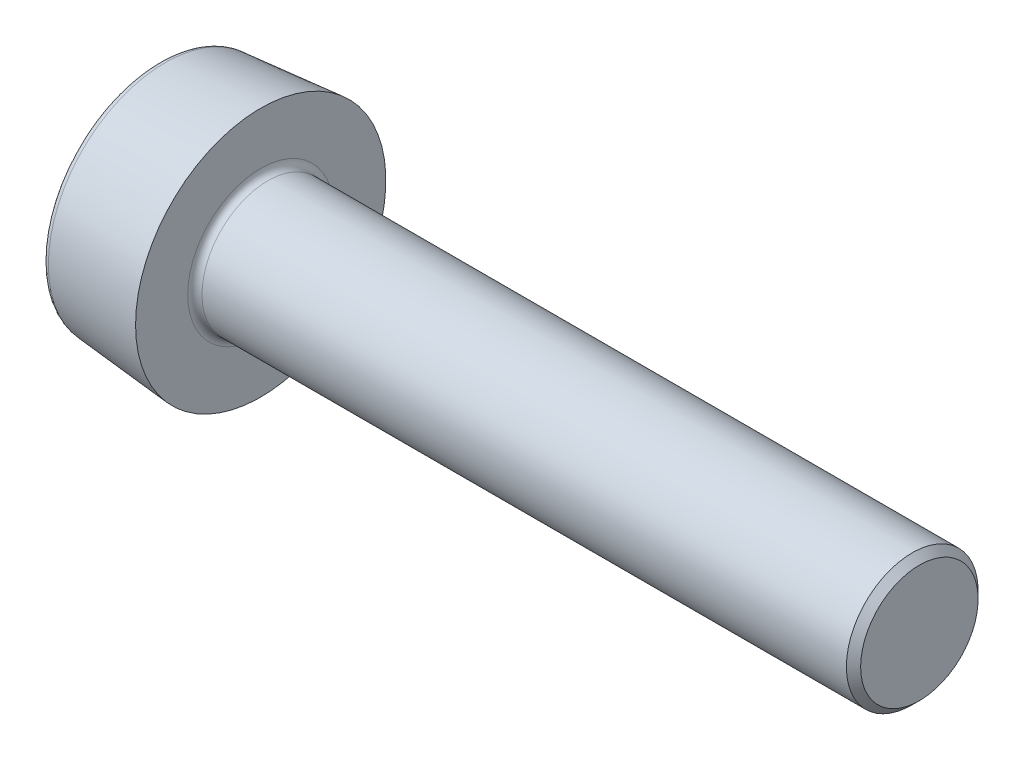
ISO-10303-21;
HEADER;
FILE_DESCRIPTION(('STEP AP214'),'2;1');
FILE_NAME('part.step','',(''),(''),'','','');
FILE_SCHEMA(('AUTOMOTIVE_DESIGN { 1 0 10303 214 1 1 1 1 }'));
ENDSEC;
DATA;
#1=APPLICATION_CONTEXT('core data for automotive mechanical design processes');
#2=APPLICATION_PROTOCOL_DEFINITION('international standard','automotive_design',2000,#1);
#3=PRODUCT_CONTEXT('',#1,'mechanical');
#4=PRODUCT('Part','Part','',(#3));
#5=PRODUCT_RELATED_PRODUCT_CATEGORY('part','',(#4));
#6=PRODUCT_DEFINITION_FORMATION('','',#4);
#7=PRODUCT_DEFINITION_CONTEXT('part definition',#1,'design');
#8=PRODUCT_DEFINITION('design','',#6,#7);
#9=PRODUCT_DEFINITION_SHAPE('','',#8);
#10=(LENGTH_UNIT() NAMED_UNIT(*) SI_UNIT(.MILLI.,.METRE.));
#11=(NAMED_UNIT(*) PLANE_ANGLE_UNIT() SI_UNIT($,.RADIAN.));
#12=(NAMED_UNIT(*) SI_UNIT($,.STERADIAN.) SOLID_ANGLE_UNIT());
#13=UNCERTAINTY_MEASURE_WITH_UNIT(LENGTH_MEASURE(1.E-05),#10,'distance_accuracy_value','');
#14=(GEOMETRIC_REPRESENTATION_CONTEXT(3) GLOBAL_UNCERTAINTY_ASSIGNED_CONTEXT((#13)) GLOBAL_UNIT_ASSIGNED_CONTEXT((#10,
#11,#12)) REPRESENTATION_CONTEXT('',''));
#15=CARTESIAN_POINT('',(0.,0.,0.));
#16=DIRECTION('',(0.,0.,1.));
#17=DIRECTION('',(1.,0.,0.));
#18=AXIS2_PLACEMENT_3D('',#15,#16,#17);
#19=CARTESIAN_POINT('',(0.,0.,0.));
#20=DIRECTION('',(-1.,0.,0.));
#21=DIRECTION('',(0.,0.,1.));
#22=AXIS2_PLACEMENT_3D('',#19,#20,#21);
#23=CYLINDRICAL_SURFACE('',#22,1.);
#24=CARTESIAN_POINT('',(9.89175,0.,0.));
#25=DIRECTION('',(-1.,0.,0.));
#26=DIRECTION('',(0.,0.,1.));
#27=AXIS2_PLACEMENT_3D('',#24,#25,#26);
#28=CIRCLE('',#27,1.);
#29=CARTESIAN_POINT('',(9.89175,0.,1.));
#30=VERTEX_POINT('',#29);
#31=EDGE_CURVE('E322',#30,#30,#28,.T.);
#32=ORIENTED_EDGE('',*,*,#31,.T.);
#33=EDGE_LOOP('',(#32));
#34=FACE_BOUND('',#33,.T.);
#35=CARTESIAN_POINT('',(0.10825,0.,0.));
#36=DIRECTION('',(-1.,0.,0.));
#37=DIRECTION('',(0.,0.,1.));
#38=AXIS2_PLACEMENT_3D('',#35,#36,#37);
#39=CIRCLE('',#38,1.);
#40=CARTESIAN_POINT('',(0.10825,0.,1.));
#41=VERTEX_POINT('',#40);
#42=EDGE_CURVE('E11',#41,#41,#39,.T.);
#43=ORIENTED_EDGE('',*,*,#42,.F.);
#44=EDGE_LOOP('',(#43));
#45=FACE_BOUND('',#44,.T.);
#46=ADVANCED_FACE('F17',(#34,#45),#23,.T.);
#47=CARTESIAN_POINT('',(0.10825,0.,0.));
#48=DIRECTION('',(-1.,0.,0.));
#49=DIRECTION('',(0.,0.,1.));
#50=AXIS2_PLACEMENT_3D('',#47,#48,#49);
#51=TOROIDAL_SURFACE('',#50,1.10825,0.10825);
#52=ORIENTED_EDGE('',*,*,#42,.T.);
#53=EDGE_LOOP('',(#52));
#54=FACE_BOUND('',#53,.T.);
#55=CARTESIAN_POINT('',(0.,0.,0.));
#56=DIRECTION('',(-1.,0.,0.));
#57=DIRECTION('',(0.,0.,1.));
#58=AXIS2_PLACEMENT_3D('',#55,#56,#57);
#59=CIRCLE('',#58,1.10825);
#60=CARTESIAN_POINT('',(0.,0.,1.10825));
#61=VERTEX_POINT('',#60);
#62=EDGE_CURVE('E25',#61,#61,#59,.T.);
#63=ORIENTED_EDGE('',*,*,#62,.F.);
#64=EDGE_LOOP('',(#63));
#65=FACE_BOUND('',#64,.T.);
#66=ADVANCED_FACE('F354',(#54,#65),#51,.F.);
#67=CARTESIAN_POINT('',(0.,1.10825,0.));
#68=DIRECTION('',(-1.,0.,0.));
#69=DIRECTION('',(0.,0.,1.));
#70=AXIS2_PLACEMENT_3D('',#67,#68,#69);
#71=PLANE('',#70);
#72=CARTESIAN_POINT('',(0.,0.,0.));
#73=DIRECTION('',(-1.,0.,0.));
#74=DIRECTION('',(0.,0.,1.));
#75=AXIS2_PLACEMENT_3D('',#72,#73,#74);
#76=CIRCLE('',#75,1.9);
#77=CARTESIAN_POINT('',(0.,0.,1.9));
#78=VERTEX_POINT('',#77);
#79=EDGE_CURVE('E342',#78,#78,#76,.T.);
#80=ORIENTED_EDGE('',*,*,#79,.F.);
#81=EDGE_LOOP('',(#80));
#82=FACE_BOUND('',#81,.T.);
#83=ORIENTED_EDGE('',*,*,#62,.T.);
#84=EDGE_LOOP('',(#83));
#85=FACE_BOUND('',#84,.T.);
#86=ADVANCED_FACE('F352',(#82,#85),#71,.F.);
#87=CARTESIAN_POINT('',(-1.45118460915243,0.,0.));
#88=DIRECTION('',(1.,0.,0.));
#89=DIRECTION('',(0.,0.,-1.));
#90=AXIS2_PLACEMENT_3D('',#87,#88,#89);
#91=CONICAL_SURFACE('',#90,1.77303779801586,0.0872664625997164);
#92=ORIENTED_EDGE('',*,*,#79,.T.);
#93=EDGE_LOOP('',(#92));
#94=FACE_BOUND('',#93,.T.);
#95=CARTESIAN_POINT('',(-1.45118460915243,0.,0.));
#96=DIRECTION('',(-1.,0.,0.));
#97=DIRECTION('',(0.,0.,1.));
#98=AXIS2_PLACEMENT_3D('',#95,#96,#97);
#99=CIRCLE('',#98,1.77303779801586);
#100=CARTESIAN_POINT('',(-1.45118460915243,0.,1.77303779801586));
#101=VERTEX_POINT('',#100);
#102=EDGE_CURVE('E338',#101,#101,#99,.T.);
#103=ORIENTED_EDGE('',*,*,#102,.F.);
#104=EDGE_LOOP('',(#103));
#105=FACE_BOUND('',#104,.T.);
#106=ADVANCED_FACE('F362',(#94,#105),#91,.T.);
#107=CARTESIAN_POINT('',(-1.44175,0.,0.));
#108=DIRECTION('',(-1.,0.,0.));
#109=DIRECTION('',(0.,0.,1.));
#110=AXIS2_PLACEMENT_3D('',#107,#108,#109);
#111=TOROIDAL_SURFACE('',#110,1.66519972194743,0.10825);
#112=CARTESIAN_POINT('',(-1.55,0.,0.));
#113=DIRECTION('',(-1.,0.,0.));
#114=DIRECTION('',(0.,0.,1.));
#115=AXIS2_PLACEMENT_3D('',#112,#113,#114);
#116=CIRCLE('',#115,1.66519972194743);
#117=CARTESIAN_POINT('',(-1.55,0.,1.66519972194743));
#118=VERTEX_POINT('',#117);
#119=EDGE_CURVE('E334',#118,#118,#116,.T.);
#120=ORIENTED_EDGE('',*,*,#119,.F.);
#121=EDGE_LOOP('',(#120));
#122=FACE_BOUND('',#121,.T.);
#123=ORIENTED_EDGE('',*,*,#102,.T.);
#124=EDGE_LOOP('',(#123));
#125=FACE_BOUND('',#124,.T.);
#126=ADVANCED_FACE('F369',(#122,#125),#111,.T.);
#127=CARTESIAN_POINT('',(-1.55,0.,0.));
#128=DIRECTION('',(-1.,0.,0.));
#129=DIRECTION('',(0.,0.,1.));
#130=AXIS2_PLACEMENT_3D('',#127,#128,#129);
#131=PLANE('',#130);
#132=CARTESIAN_POINT('',(-1.55,-1.06088111963594,-0.6125));
#133=DIRECTION('',(1.,0.,0.));
#134=DIRECTION('',(0.,0.,-1.));
#135=AXIS2_PLACEMENT_3D('',#132,#133,#134);
#136=CIRCLE('',#135,0.554830537352329);
#137=CARTESIAN_POINT('',(-1.55,-0.514312095755914,-0.707889870078079));
#138=VERTEX_POINT('',#137);
#139=CARTESIAN_POINT('',(-1.55,-0.870206658447239,-0.0914624053591971));
#140=VERTEX_POINT('',#139);
#141=EDGE_CURVE('E217',#138,#140,#136,.T.);
#142=ORIENTED_EDGE('',*,*,#141,.F.);
#143=CARTESIAN_POINT('',(-1.55,0.,0.));
#144=DIRECTION('',(-1.,0.,0.));
#145=DIRECTION('',(0.,0.,1.));
#146=AXIS2_PLACEMENT_3D('',#143,#144,#145);
#147=CIRCLE('',#146,0.875);
#148=CARTESIAN_POINT('',(-1.55,-0.355894562691325,-0.799352275437276));
#149=VERTEX_POINT('',#148);
#150=EDGE_CURVE('E156',#149,#138,#147,.T.);
#151=ORIENTED_EDGE('',*,*,#150,.F.);
#152=CARTESIAN_POINT('',(-1.55,0.,-1.225));
#153=DIRECTION('',(1.,0.,0.));
#154=DIRECTION('',(0.,0.,-1.));
#155=AXIS2_PLACEMENT_3D('',#152,#153,#154);
#156=CIRCLE('',#155,0.554830537352329);
#157=CARTESIAN_POINT('',(-1.55,0.355894562691326,-0.799352275437276));
#158=VERTEX_POINT('',#157);
#159=EDGE_CURVE('E213',#158,#149,#156,.T.);
#160=ORIENTED_EDGE('',*,*,#159,.F.);
#161=CARTESIAN_POINT('',(-1.55,0.514312095755914,-0.707889870078079));
#162=VERTEX_POINT('',#161);
#163=EDGE_CURVE('E148',#162,#158,#147,.T.);
#164=ORIENTED_EDGE('',*,*,#163,.F.);
#165=CARTESIAN_POINT('',(-1.55,1.06088111963594,-0.6125));
#166=DIRECTION('',(1.,0.,0.));
#167=DIRECTION('',(0.,0.,-1.));
#168=AXIS2_PLACEMENT_3D('',#165,#166,#167);
#169=CIRCLE('',#168,0.554830537352329);
#170=CARTESIAN_POINT('',(-1.55,0.87020665844724,-0.0914624053591967));
#171=VERTEX_POINT('',#170);
#172=EDGE_CURVE('E209',#171,#162,#169,.T.);
#173=ORIENTED_EDGE('',*,*,#172,.F.);
#174=CARTESIAN_POINT('',(-1.55,0.870206658447239,0.0914624053591969));
#175=VERTEX_POINT('',#174);
#176=EDGE_CURVE('E136',#175,#171,#147,.T.);
#177=ORIENTED_EDGE('',*,*,#176,.F.);
#178=CARTESIAN_POINT('',(-1.55,1.06088111963594,0.6125));
#179=DIRECTION('',(1.,0.,0.));
#180=DIRECTION('',(0.,0.,-1.));
#181=AXIS2_PLACEMENT_3D('',#178,#179,#180);
#182=CIRCLE('',#181,0.554830537352329);
#183=CARTESIAN_POINT('',(-1.55,0.514312095755914,0.707889870078079));
#184=VERTEX_POINT('',#183);
#185=EDGE_CURVE('E133',#184,#175,#182,.T.);
#186=ORIENTED_EDGE('',*,*,#185,.F.);
#187=CARTESIAN_POINT('',(-1.55,0.355894562691326,0.799352275437276));
#188=VERTEX_POINT('',#187);
#189=EDGE_CURVE('E32',#188,#184,#147,.T.);
#190=ORIENTED_EDGE('',*,*,#189,.F.);
#191=CARTESIAN_POINT('',(-1.55,0.,1.225));
#192=DIRECTION('',(1.,0.,0.));
#193=DIRECTION('',(0.,0.,-1.));
#194=AXIS2_PLACEMENT_3D('',#191,#192,#193);
#195=CIRCLE('',#194,0.554830537352329);
#196=CARTESIAN_POINT('',(-1.55,-0.355894562691325,0.799352275437276));
#197=VERTEX_POINT('',#196);
#198=EDGE_CURVE('E119',#197,#188,#195,.T.);
#199=ORIENTED_EDGE('',*,*,#198,.F.);
#200=CARTESIAN_POINT('',(-1.55,-0.514312095755914,0.707889870078079));
#201=VERTEX_POINT('',#200);
#202=EDGE_CURVE('E138',#201,#197,#147,.T.);
#203=ORIENTED_EDGE('',*,*,#202,.F.);
#204=CARTESIAN_POINT('',(-1.55,-1.06088111963594,0.6125));
#205=DIRECTION('',(1.,0.,0.));
#206=DIRECTION('',(0.,0.,-1.));
#207=AXIS2_PLACEMENT_3D('',#204,#205,#206);
#208=CIRCLE('',#207,0.554830537352329);
#209=CARTESIAN_POINT('',(-1.55,-0.870206658447239,0.091462405359197));
#210=VERTEX_POINT('',#209);
#211=EDGE_CURVE('E125',#210,#201,#208,.T.);
#212=ORIENTED_EDGE('',*,*,#211,.F.);
#213=EDGE_CURVE('E151',#140,#210,#147,.T.);
#214=ORIENTED_EDGE('',*,*,#213,.F.);
#215=EDGE_LOOP('',(#142,#151,#160,#164,#173,#177,#186,#190,#199,#203,#212,#214));
#216=FACE_BOUND('',#215,.T.);
#217=ORIENTED_EDGE('',*,*,#119,.T.);
#218=EDGE_LOOP('',(#217));
#219=FACE_BOUND('',#218,.T.);
#220=ADVANCED_FACE('F129',(#216,#219),#131,.T.);
#221=CARTESIAN_POINT('',(10.,0.,0.));
#222=DIRECTION('',(-1.,0.,0.));
#223=DIRECTION('',(0.,0.,1.));
#224=AXIS2_PLACEMENT_3D('',#221,#222,#223);
#225=PLANE('',#224);
#226=CARTESIAN_POINT('',(10.,0.,0.));
#227=DIRECTION('',(-1.,0.,0.));
#228=DIRECTION('',(0.,0.,1.));
#229=AXIS2_PLACEMENT_3D('',#226,#227,#228);
#230=CIRCLE('',#229,0.89175);
#231=CARTESIAN_POINT('',(10.,0.,0.89175));
#232=VERTEX_POINT('',#231);
#233=EDGE_CURVE('E330',#232,#232,#230,.T.);
#234=ORIENTED_EDGE('',*,*,#233,.F.);
#235=EDGE_LOOP('',(#234));
#236=FACE_BOUND('',#235,.T.);
#237=ADVANCED_FACE('F376',(#236),#225,.F.);
#238=CARTESIAN_POINT('',(9.89175,0.,0.));
#239=DIRECTION('',(-1.,0.,0.));
#240=DIRECTION('',(0.,0.,1.));
#241=AXIS2_PLACEMENT_3D('',#238,#239,#240);
#242=CONICAL_SURFACE('',#241,1.,0.78539816339745);
#243=ORIENTED_EDGE('',*,*,#233,.T.);
#244=EDGE_LOOP('',(#243));
#245=FACE_BOUND('',#244,.T.);
#246=ORIENTED_EDGE('',*,*,#31,.F.);
#247=EDGE_LOOP('',(#246));
#248=FACE_BOUND('',#247,.T.);
#249=ADVANCED_FACE('F379',(#245,#248),#242,.T.);
#250=CARTESIAN_POINT('',(-1.55,0.,0.));
#251=DIRECTION('',(-1.,0.,0.));
#252=DIRECTION('',(0.,0.,1.));
#253=AXIS2_PLACEMENT_3D('',#250,#251,#252);
#254=CYLINDRICAL_SURFACE('',#253,0.875);
#255=ORIENTED_EDGE('',*,*,#176,.T.);
#256=DIRECTION('',(-1.,0.,0.));
#257=VECTOR('',#256,1.);
#258=CARTESIAN_POINT('',(0.,0.87020665844724,-0.0914624053591966));
#259=LINE('',#258,#257);
#260=CARTESIAN_POINT('',(-0.71,0.870206658447239,-0.0914624053591966));
#261=VERTEX_POINT('',#260);
#262=EDGE_CURVE('E203',#261,#171,#259,.T.);
#263=ORIENTED_EDGE('',*,*,#262,.F.);
#264=CARTESIAN_POINT('',(-0.71,0.,0.));
#265=DIRECTION('',(-1.,0.,0.));
#266=DIRECTION('',(0.,0.,1.));
#267=AXIS2_PLACEMENT_3D('',#264,#265,#266);
#268=CIRCLE('',#267,0.875);
#269=CARTESIAN_POINT('',(-0.71,0.870206658447239,0.0914624053591969));
#270=VERTEX_POINT('',#269);
#271=EDGE_CURVE('E158',#270,#261,#268,.T.);
#272=ORIENTED_EDGE('',*,*,#271,.F.);
#273=DIRECTION('',(-1.,0.,0.));
#274=VECTOR('',#273,1.);
#275=CARTESIAN_POINT('',(0.,0.870206658447239,0.091462405359197));
#276=LINE('',#275,#274);
#277=EDGE_CURVE('E124',#270,#175,#276,.T.);
#278=ORIENTED_EDGE('',*,*,#277,.T.);
#279=EDGE_LOOP('',(#255,#263,#272,#278));
#280=FACE_BOUND('',#279,.T.);
#281=ADVANCED_FACE('F382',(#280),#254,.F.);
#282=CARTESIAN_POINT('',(-0.71,0.355894562691326,0.799352275437276));
#283=VERTEX_POINT('',#282);
#284=CARTESIAN_POINT('',(-0.71,0.514312095755914,0.707889870078079));
#285=VERTEX_POINT('',#284);
#286=EDGE_CURVE('E113',#283,#285,#268,.T.);
#287=ORIENTED_EDGE('',*,*,#286,.F.);
#288=DIRECTION('',(-1.,0.,0.));
#289=VECTOR('',#288,1.);
#290=CARTESIAN_POINT('',(0.,0.355894562691326,0.799352275437276));
#291=LINE('',#290,#289);
#292=EDGE_CURVE('E109',#283,#188,#291,.T.);
#293=ORIENTED_EDGE('',*,*,#292,.T.);
#294=ORIENTED_EDGE('',*,*,#189,.T.);
#295=DIRECTION('',(-1.,0.,0.));
#296=VECTOR('',#295,1.);
#297=CARTESIAN_POINT('',(0.,0.514312095755914,0.707889870078079));
#298=LINE('',#297,#296);
#299=EDGE_CURVE('E116',#285,#184,#298,.T.);
#300=ORIENTED_EDGE('',*,*,#299,.F.);
#301=EDGE_LOOP('',(#287,#293,#294,#300));
#302=FACE_BOUND('',#301,.T.);
#303=ADVANCED_FACE('F111',(#302),#254,.F.);
#304=CARTESIAN_POINT('',(-0.71,-0.514312095755914,0.70788987007808));
#305=VERTEX_POINT('',#304);
#306=CARTESIAN_POINT('',(-0.71,-0.355894562691325,0.799352275437276));
#307=VERTEX_POINT('',#306);
#308=EDGE_CURVE('E159',#305,#307,#268,.T.);
#309=ORIENTED_EDGE('',*,*,#308,.F.);
#310=DIRECTION('',(-1.,0.,0.));
#311=VECTOR('',#310,1.);
#312=CARTESIAN_POINT('',(0.,-0.514312095755914,0.70788987007808));
#313=LINE('',#312,#311);
#314=EDGE_CURVE('E183',#305,#201,#313,.T.);
#315=ORIENTED_EDGE('',*,*,#314,.T.);
#316=ORIENTED_EDGE('',*,*,#202,.T.);
#317=DIRECTION('',(-1.,0.,0.));
#318=VECTOR('',#317,1.);
#319=CARTESIAN_POINT('',(0.,-0.355894562691325,0.799352275437276));
#320=LINE('',#319,#318);
#321=EDGE_CURVE('E40',#307,#197,#320,.T.);
#322=ORIENTED_EDGE('',*,*,#321,.F.);
#323=EDGE_LOOP('',(#309,#315,#316,#322));
#324=FACE_BOUND('',#323,.T.);
#325=ADVANCED_FACE('F395',(#324),#254,.F.);
#326=CARTESIAN_POINT('',(-0.71,-0.870206658447239,-0.0914624053591971));
#327=VERTEX_POINT('',#326);
#328=CARTESIAN_POINT('',(-0.71,-0.870206658447239,0.0914624053591971));
#329=VERTEX_POINT('',#328);
#330=EDGE_CURVE('E169',#327,#329,#268,.T.);
#331=ORIENTED_EDGE('',*,*,#330,.F.);
#332=DIRECTION('',(-1.,0.,0.));
#333=VECTOR('',#332,1.);
#334=CARTESIAN_POINT('',(0.,-0.870206658447239,-0.0914624053591971));
#335=LINE('',#334,#333);
#336=EDGE_CURVE('E188',#327,#140,#335,.T.);
#337=ORIENTED_EDGE('',*,*,#336,.T.);
#338=ORIENTED_EDGE('',*,*,#213,.T.);
#339=DIRECTION('',(-1.,0.,0.));
#340=VECTOR('',#339,1.);
#341=CARTESIAN_POINT('',(0.,-0.870206658447239,0.0914624053591971));
#342=LINE('',#341,#340);
#343=EDGE_CURVE('E185',#329,#210,#342,.T.);
#344=ORIENTED_EDGE('',*,*,#343,.F.);
#345=EDGE_LOOP('',(#331,#337,#338,#344));
#346=FACE_BOUND('',#345,.T.);
#347=ADVANCED_FACE('F232',(#346),#254,.F.);
#348=CARTESIAN_POINT('',(-0.71,-0.355894562691325,-0.799352275437276));
#349=VERTEX_POINT('',#348);
#350=CARTESIAN_POINT('',(-0.71,-0.514312095755914,-0.707889870078079));
#351=VERTEX_POINT('',#350);
#352=EDGE_CURVE('E175',#349,#351,#268,.T.);
#353=ORIENTED_EDGE('',*,*,#352,.F.);
#354=DIRECTION('',(-1.,0.,0.));
#355=VECTOR('',#354,1.);
#356=CARTESIAN_POINT('',(0.,-0.355894562691325,-0.799352275437276));
#357=LINE('',#356,#355);
#358=EDGE_CURVE('E194',#349,#149,#357,.T.);
#359=ORIENTED_EDGE('',*,*,#358,.T.);
#360=ORIENTED_EDGE('',*,*,#150,.T.);
#361=DIRECTION('',(-1.,0.,0.));
#362=VECTOR('',#361,1.);
#363=CARTESIAN_POINT('',(0.,-0.514312095755914,-0.707889870078079));
#364=LINE('',#363,#362);
#365=EDGE_CURVE('E191',#351,#138,#364,.T.);
#366=ORIENTED_EDGE('',*,*,#365,.F.);
#367=EDGE_LOOP('',(#353,#359,#360,#366));
#368=FACE_BOUND('',#367,.T.);
#369=ADVANCED_FACE('F242',(#368),#254,.F.);
#370=CARTESIAN_POINT('',(-0.71,0.514312095755914,-0.707889870078079));
#371=VERTEX_POINT('',#370);
#372=CARTESIAN_POINT('',(-0.71,0.355894562691326,-0.799352275437276));
#373=VERTEX_POINT('',#372);
#374=EDGE_CURVE('E165',#371,#373,#268,.T.);
#375=ORIENTED_EDGE('',*,*,#374,.F.);
#376=DIRECTION('',(-1.,0.,0.));
#377=VECTOR('',#376,1.);
#378=CARTESIAN_POINT('',(0.,0.514312095755914,-0.707889870078079));
#379=LINE('',#378,#377);
#380=EDGE_CURVE('E200',#371,#162,#379,.T.);
#381=ORIENTED_EDGE('',*,*,#380,.T.);
#382=ORIENTED_EDGE('',*,*,#163,.T.);
#383=DIRECTION('',(-1.,0.,0.));
#384=VECTOR('',#383,1.);
#385=CARTESIAN_POINT('',(0.,0.355894562691326,-0.799352275437276));
#386=LINE('',#385,#384);
#387=EDGE_CURVE('E197',#373,#158,#386,.T.);
#388=ORIENTED_EDGE('',*,*,#387,.F.);
#389=EDGE_LOOP('',(#375,#381,#382,#388));
#390=FACE_BOUND('',#389,.T.);
#391=ADVANCED_FACE('F253',(#390),#254,.F.);
#392=CARTESIAN_POINT('',(-0.71,0.,0.));
#393=DIRECTION('',(-1.,0.,0.));
#394=DIRECTION('',(0.,0.,1.));
#395=AXIS2_PLACEMENT_3D('',#392,#393,#394);
#396=CONICAL_SURFACE('',#395,0.875,1.0471975511966);
#397=CARTESIAN_POINT('',(-0.204818514459078,0.,0.));
#398=VERTEX_POINT('',#397);
#399=VERTEX_LOOP('',#398);
#400=FACE_BOUND('',#399,.T.);
#401=ORIENTED_EDGE('',*,*,#271,.T.);
#402=CARTESIAN_POINT('',(-0.710001052626692,0.51431244480936,-0.707891870078079));
#403=CARTESIAN_POINT('',(-0.702605220680132,0.511861449112985,-0.693833740382595));
#404=CARTESIAN_POINT('',(-0.695348661380436,0.509937089870482,-0.679618054209384));
#405=CARTESIAN_POINT('',(-0.681199870715218,0.50718976377691,-0.650873032869013));
#406=CARTESIAN_POINT('',(-0.674308268643652,0.506368643409787,-0.636343213123692));
#407=CARTESIAN_POINT('',(-0.654215385114916,0.505637574613548,-0.592066869281839));
#408=CARTESIAN_POINT('',(-0.641746200439491,0.507510629894216,-0.561912309856809));
#409=CARTESIAN_POINT('',(-0.622846907764662,0.515323183492735,-0.50892923404188));
#410=CARTESIAN_POINT('',(-0.615687494087997,0.5201063376338,-0.486189543720208));
#411=CARTESIAN_POINT('',(-0.603898920575902,0.532712947288116,-0.440970423896295));
#412=CARTESIAN_POINT('',(-0.59925902722865,0.54052325879175,-0.41849029610236));
#413=CARTESIAN_POINT('',(-0.593072757269823,0.559273167081217,-0.37415151229019));
#414=CARTESIAN_POINT('',(-0.591555375837922,0.570241025665982,-0.352300522844287));
#415=CARTESIAN_POINT('',(-0.591963527288072,0.594957405131819,-0.310264253305604));
#416=CARTESIAN_POINT('',(-0.593889364414075,0.608706171639652,-0.290079120573357));
#417=CARTESIAN_POINT('',(-0.600469111407169,0.636765414220176,-0.25413524483107));
#418=CARTESIAN_POINT('',(-0.604798955548615,0.650846973433819,-0.238133843054563));
#419=CARTESIAN_POINT('',(-0.615464899179857,0.680388352477729,-0.208139690747695));
#420=CARTESIAN_POINT('',(-0.621807074260817,0.695852242914255,-0.194153212042537));
#421=CARTESIAN_POINT('',(-0.639842908339476,0.736461806313988,-0.161288232915976));
#422=CARTESIAN_POINT('',(-0.65257616335824,0.762322500597224,-0.143852127606062));
#423=CARTESIAN_POINT('',(-0.673193458802746,0.80216128334655,-0.121448322340417));
#424=CARTESIAN_POINT('',(-0.680290511638441,0.815565318045385,-0.114623385592609));
#425=CARTESIAN_POINT('',(-0.694876453459336,0.842670824659511,-0.10216470001572));
#426=CARTESIAN_POINT('',(-0.702364535245654,0.856371652144609,-0.0965286095792647));
#427=CARTESIAN_POINT('',(-0.71000110420552,0.87020865844724,-0.0914616734606572));
#428=B_SPLINE_CURVE_WITH_KNOTS('',3,(#402,#403,#404,#405,#406,#407,#408,#409,#410,#411,#412,
#413,#414,#415,#416,#417,#418,#419,#420,#421,#422,#423,#424,#425,#426,#427),.UNSPECIFIED.,.F.,
.F.,(4,2,2,2,2,2,2,2,2,2,2,2,4),(0.,0.0481925322428017,0.0964656239616364,0.193964476932186,
0.2666476155972,0.339018634899243,0.412058702550792,0.485105224366299,0.550100984529281,
0.615294876404684,0.715729377907706,0.765588419744608,0.815348320436132),.UNSPECIFIED.);
#429=EDGE_CURVE('E135',#371,#261,#428,.T.);
#430=ORIENTED_EDGE('',*,*,#429,.F.);
#431=ORIENTED_EDGE('',*,*,#374,.T.);
#432=CARTESIAN_POINT('',(-0.710001351667692,-0.355896562691325,-0.799353947694597));
#433=CARTESIAN_POINT('',(-0.702605509425064,-0.344947364503633,-0.7902022401547));
#434=CARTESIAN_POINT('',(-0.695348939525855,-0.333598399365442,-0.781427835212509));
#435=CARTESIAN_POINT('',(-0.681200127013077,-0.310078143306246,-0.764676035223396));
#436=CARTESIAN_POINT('',(-0.674308513691921,-0.2979055094846,-0.756699996989411));
#437=CARTESIAN_POINT('',(-0.65421559508807,-0.259926599767232,-0.733928649691764));
#438=CARTESIAN_POINT('',(-0.641746385559962,-0.232875450586855,-0.720473450515075));
#439=CARTESIAN_POINT('',(-0.622847050314615,-0.183084471733879,-0.700747730682423));
#440=CARTESIAN_POINT('',(-0.615687618781017,-0.160999741869388,-0.693520198116896));
#441=CARTESIAN_POINT('',(-0.603899008311938,-0.115535519735332,-0.681828242709701));
#442=CARTESIAN_POINT('',(-0.599259095882154,-0.0921619947432032,-0.677352087684612));
#443=CARTESIAN_POINT('',(-0.593072788497883,-0.0443885064909393,-0.671420556035547));
#444=CARTESIAN_POINT('',(-0.591555388847561,-0.0199810517014798,-0.669993488266625));
#445=CARTESIAN_POINT('',(-0.59196350847895,0.0287816464073432,-0.670380335833328));
#446=CARTESIAN_POINT('',(-0.593889331951944,0.0531368849233457,-0.672194537518645));
#447=CARTESIAN_POINT('',(-0.600469057099951,0.098294837459113,-0.678522594852713));
#448=CARTESIAN_POINT('',(-0.604798890892469,0.119193241970638,-0.682716871289768));
#449=CARTESIAN_POINT('',(-0.615464816245447,0.159939640013102,-0.693303359766989));
#450=CARTESIAN_POINT('',(-0.621806983445828,0.17978423726785,-0.699702233017465));
#451=CARTESIAN_POINT('',(-0.639842845916377,0.228551065651935,-0.718438682249207));
#452=CARTESIAN_POINT('',(-0.652576153715208,0.256581644311438,-0.732116702627755));
#453=CARTESIAN_POINT('',(-0.673193539582896,0.295903458736222,-0.75541630261453));
#454=CARTESIAN_POINT('',(-0.680290624190807,0.30851609332687,-0.763612107136306));
#455=CARTESIAN_POINT('',(-0.694876631931881,0.332858474434854,-0.780856904797249));
#456=CARTESIAN_POINT('',(-0.702364747850179,0.344589926665725,-0.78990416900331));
#457=CARTESIAN_POINT('',(-0.710001351667692,0.355896562691326,-0.799353947694597));
#458=B_SPLINE_CURVE_WITH_KNOTS('',3,(#432,#433,#434,#435,#436,#437,#438,#439,#440,#441,#442,
#443,#444,#445,#446,#447,#448,#449,#450,#451,#452,#453,#454,#455,#456,#457),.UNSPECIFIED.,.F.,
.F.,(4,2,2,2,2,2,2,2,2,2,2,2,4),(0.,0.0481925745386227,0.0964657085632546,0.193964647597126,
0.266647829271179,0.339018891746526,0.412059005611536,0.485105572518673,0.550101332931432,
0.615295226412752,0.715730148920682,0.765589398380348,0.815349504960179),.UNSPECIFIED.);
#459=EDGE_CURVE('E144',#349,#373,#458,.T.);
#460=ORIENTED_EDGE('',*,*,#459,.F.);
#461=ORIENTED_EDGE('',*,*,#352,.T.);
#462=CARTESIAN_POINT('',(-0.71000110420552,-0.870208658447239,-0.0914616734606572));
#463=CARTESIAN_POINT('',(-0.702605270483156,-0.856808460563011,-0.0963681119944429));
#464=CARTESIAN_POINT('',(-0.695348709355316,-0.843535132966667,-0.1018094094608));
#465=CARTESIAN_POINT('',(-0.681199914921939,-0.817267545925777,-0.113802662970452));
#466=CARTESIAN_POINT('',(-0.674308310910093,-0.804273790066064,-0.120356460405081));
#467=CARTESIAN_POINT('',(-0.654215421331478,-0.765563808982452,-0.141861504589476));
#468=CARTESIAN_POINT('',(-0.641746232369308,-0.740385716596228,-0.158560895970153));
#469=CARTESIAN_POINT('',(-0.622846932351308,-0.69840729495712,-0.191818301151553));
#470=CARTESIAN_POINT('',(-0.615687515594298,-0.681105719201868,-0.207330478043437));
#471=CARTESIAN_POINT('',(-0.603898935708129,-0.648248110661504,-0.24085768036086));
#472=CARTESIAN_POINT('',(-0.599259039069877,-0.632684901135286,-0.258861671884819));
#473=CARTESIAN_POINT('',(-0.593072762656979,-0.603661334850991,-0.297268960650984));
#474=CARTESIAN_POINT('',(-0.591555378082692,-0.590221748451516,-0.317692900065157));
#475=CARTESIAN_POINT('',(-0.591963524042721,-0.566175453695235,-0.360116049381058));
#476=CARTESIAN_POINT('',(-0.593889358814001,-0.555568995763988,-0.382115398318397));
#477=CARTESIAN_POINT('',(-0.600469102044498,-0.538470302423355,-0.424387354485704));
#478=CARTESIAN_POINT('',(-0.604798944408623,-0.531653459607181,-0.444583043150671));
#479=CARTESIAN_POINT('',(-0.615464884893508,-0.520448447353794,-0.485163703887798));
#480=CARTESIAN_POINT('',(-0.621807058608202,-0.516067744781761,-0.505549065296823));
#481=CARTESIAN_POINT('',(-0.639842886366344,-0.507910616447085,-0.557150459345471));
#482=CARTESIAN_POINT('',(-0.652576135596162,-0.505740850550957,-0.588264521282897));
#483=CARTESIAN_POINT('',(-0.673193422164066,-0.50625797112999,-0.633967809278167));
#484=CARTESIAN_POINT('',(-0.680290472014826,-0.507049417464082,-0.64898850817274));
#485=CARTESIAN_POINT('',(-0.694876407856488,-0.509812627131581,-0.678691900496106));
#486=CARTESIAN_POINT('',(-0.702364486648977,-0.511782040360869,-0.693375206634782));
#487=CARTESIAN_POINT('',(-0.710001052626692,-0.51431244480936,-0.707891870078079));
#488=B_SPLINE_CURVE_WITH_KNOTS('',3,(#462,#463,#464,#465,#466,#467,#468,#469,#470,#471,#472,
#473,#474,#475,#476,#477,#478,#479,#480,#481,#482,#483,#484,#485,#486,#487),.UNSPECIFIED.,.F.,
.F.,(4,2,2,2,2,2,2,2,2,2,2,2,4),(0.,0.0481925395375568,0.0964656385528714,0.193964506368626,
0.266647652456066,0.339018679200469,0.412058754800718,0.485105284415885,0.550101044713877,
0.615294936774283,0.715729407998992,0.765588434742314,0.815348320422255),.UNSPECIFIED.);
#489=EDGE_CURVE('E238',#327,#351,#488,.T.);
#490=ORIENTED_EDGE('',*,*,#489,.F.);
#491=ORIENTED_EDGE('',*,*,#330,.T.);
#492=CARTESIAN_POINT('',(-0.710001052626692,-0.514312444809359,0.70789187007808));
#493=CARTESIAN_POINT('',(-0.702605220680132,-0.511861449112985,0.693833740382596));
#494=CARTESIAN_POINT('',(-0.695348661380437,-0.509937089870482,0.679618054209385));
#495=CARTESIAN_POINT('',(-0.681199870715218,-0.50718976377691,0.650873032869013));
#496=CARTESIAN_POINT('',(-0.674308268643652,-0.506368643409787,0.636343213123692));
#497=CARTESIAN_POINT('',(-0.654215385114916,-0.505637574613548,0.592066869281839));
#498=CARTESIAN_POINT('',(-0.641746200439491,-0.507510629894216,0.561912309856809));
#499=CARTESIAN_POINT('',(-0.622846907764663,-0.515323183492735,0.50892923404188));
#500=CARTESIAN_POINT('',(-0.615687494087997,-0.5201063376338,0.486189543720208));
#501=CARTESIAN_POINT('',(-0.603898920575902,-0.532712947288116,0.440970423896295));
#502=CARTESIAN_POINT('',(-0.59925902722865,-0.54052325879175,0.41849029610236));
#503=CARTESIAN_POINT('',(-0.593072757269823,-0.559273167081217,0.37415151229019));
#504=CARTESIAN_POINT('',(-0.591555375837922,-0.570241025665982,0.352300522844287));
#505=CARTESIAN_POINT('',(-0.591963527288072,-0.594957405131819,0.310264253305604));
#506=CARTESIAN_POINT('',(-0.593889364414075,-0.608706171639652,0.290079120573357));
#507=CARTESIAN_POINT('',(-0.600469111407169,-0.636765414220176,0.25413524483107));
#508=CARTESIAN_POINT('',(-0.604798955548614,-0.650846973433819,0.238133843054563));
#509=CARTESIAN_POINT('',(-0.615464899179857,-0.680388352477729,0.208139690747695));
#510=CARTESIAN_POINT('',(-0.621807074260817,-0.695852242914255,0.194153212042538));
#511=CARTESIAN_POINT('',(-0.639842908339476,-0.736461806313988,0.161288232915977));
#512=CARTESIAN_POINT('',(-0.65257616335824,-0.762322500597224,0.143852127606062));
#513=CARTESIAN_POINT('',(-0.673193458802746,-0.80216128334655,0.121448322340418));
#514=CARTESIAN_POINT('',(-0.680290511638441,-0.815565318045385,0.114623385592609));
#515=CARTESIAN_POINT('',(-0.694876453459336,-0.84267082465951,0.102164700015721));
#516=CARTESIAN_POINT('',(-0.702364535245654,-0.856371652144609,0.0965286095792652));
#517=CARTESIAN_POINT('',(-0.71000110420552,-0.870208658447239,0.0914616734606575));
#518=B_SPLINE_CURVE_WITH_KNOTS('',3,(#492,#493,#494,#495,#496,#497,#498,#499,#500,#501,#502,
#503,#504,#505,#506,#507,#508,#509,#510,#511,#512,#513,#514,#515,#516,#517),.UNSPECIFIED.,.F.,
.F.,(4,2,2,2,2,2,2,2,2,2,2,2,4),(0.,0.0481925322428018,0.0964656239616367,0.193964476932187,
0.266647615597201,0.339018634899244,0.412058702550792,0.4851052243663,0.550100984529281,
0.615294876404685,0.715729377907706,0.765588419744608,0.815348320436132),.UNSPECIFIED.);
#519=EDGE_CURVE('E270',#305,#329,#518,.T.);
#520=ORIENTED_EDGE('',*,*,#519,.F.);
#521=ORIENTED_EDGE('',*,*,#308,.T.);
#522=CARTESIAN_POINT('',(-0.710001351667692,0.355896562691326,0.799353947694597));
#523=CARTESIAN_POINT('',(-0.702605509425064,0.344947364503633,0.7902022401547));
#524=CARTESIAN_POINT('',(-0.695348939525856,0.333598399365442,0.781427835212509));
#525=CARTESIAN_POINT('',(-0.681200127013077,0.310078143306246,0.764676035223396));
#526=CARTESIAN_POINT('',(-0.674308513691921,0.2979055094846,0.756699996989411));
#527=CARTESIAN_POINT('',(-0.65421559508807,0.259926599767232,0.733928649691764));
#528=CARTESIAN_POINT('',(-0.641746385559962,0.232875450586855,0.720473450515075));
#529=CARTESIAN_POINT('',(-0.622847050314615,0.183084471733879,0.700747730682423));
#530=CARTESIAN_POINT('',(-0.615687618781017,0.160999741869388,0.693520198116896));
#531=CARTESIAN_POINT('',(-0.603899008311938,0.115535519735333,0.681828242709701));
#532=CARTESIAN_POINT('',(-0.599259095882154,0.0921619947432035,0.677352087684612));
#533=CARTESIAN_POINT('',(-0.593072788497883,0.0443885064909394,0.671420556035547));
#534=CARTESIAN_POINT('',(-0.591555388847561,0.01998105170148,0.669993488266625));
#535=CARTESIAN_POINT('',(-0.59196350847895,-0.028781646407343,0.670380335833328));
#536=CARTESIAN_POINT('',(-0.593889331951944,-0.0531368849233455,0.672194537518645));
#537=CARTESIAN_POINT('',(-0.600469057099951,-0.0982948374591128,0.678522594852713));
#538=CARTESIAN_POINT('',(-0.604798890892469,-0.119193241970638,0.682716871289768));
#539=CARTESIAN_POINT('',(-0.615464816245447,-0.159939640013102,0.693303359766989));
#540=CARTESIAN_POINT('',(-0.621806983445828,-0.17978423726785,0.699702233017465));
#541=CARTESIAN_POINT('',(-0.639842845916377,-0.228551065651935,0.718438682249207));
#542=CARTESIAN_POINT('',(-0.652576153715208,-0.256581644311437,0.732116702627755));
#543=CARTESIAN_POINT('',(-0.673193539582896,-0.295903458736221,0.75541630261453));
#544=CARTESIAN_POINT('',(-0.680290624190807,-0.308516093326869,0.763612107136306));
#545=CARTESIAN_POINT('',(-0.694876631931881,-0.332858474434853,0.780856904797249));
#546=CARTESIAN_POINT('',(-0.702364747850179,-0.344589926665724,0.789904169003309));
#547=CARTESIAN_POINT('',(-0.710001351667692,-0.355896562691325,0.799353947694597));
#548=B_SPLINE_CURVE_WITH_KNOTS('',3,(#522,#523,#524,#525,#526,#527,#528,#529,#530,#531,#532,
#533,#534,#535,#536,#537,#538,#539,#540,#541,#542,#543,#544,#545,#546,#547),.UNSPECIFIED.,.F.,
.F.,(4,2,2,2,2,2,2,2,2,2,2,2,4),(0.,0.0481925745386226,0.0964657085632546,0.193964647597126,
0.266647829271179,0.339018891746526,0.412059005611537,0.485105572518673,0.550101332931432,
0.615295226412753,0.715730148920682,0.765589398380348,0.815349504960179),.UNSPECIFIED.);
#549=EDGE_CURVE('E274',#283,#307,#548,.T.);
#550=ORIENTED_EDGE('',*,*,#549,.F.);
#551=ORIENTED_EDGE('',*,*,#286,.T.);
#552=CARTESIAN_POINT('',(-0.71000110420552,0.870208658447239,0.091461673460657));
#553=CARTESIAN_POINT('',(-0.702605270483156,0.856808460563011,0.0963681119944432));
#554=CARTESIAN_POINT('',(-0.695348709355316,0.843535132966668,0.101809409460801));
#555=CARTESIAN_POINT('',(-0.681199914921939,0.817267545925777,0.113802662970453));
#556=CARTESIAN_POINT('',(-0.674308310910093,0.804273790066065,0.120356460405082));
#557=CARTESIAN_POINT('',(-0.654215421331478,0.765563808982452,0.141861504589477));
#558=CARTESIAN_POINT('',(-0.641746232369308,0.740385716596227,0.158560895970153));
#559=CARTESIAN_POINT('',(-0.622846932351308,0.698407294957121,0.191818301151553));
#560=CARTESIAN_POINT('',(-0.615687515594299,0.681105719201869,0.207330478043438));
#561=CARTESIAN_POINT('',(-0.60389893570813,0.648248110661505,0.240857680360861));
#562=CARTESIAN_POINT('',(-0.599259039069878,0.632684901135286,0.258861671884819));
#563=CARTESIAN_POINT('',(-0.59307276265698,0.603661334850991,0.297268960650984));
#564=CARTESIAN_POINT('',(-0.591555378082693,0.590221748451517,0.317692900065158));
#565=CARTESIAN_POINT('',(-0.591963524042721,0.566175453695237,0.360116049381058));
#566=CARTESIAN_POINT('',(-0.593889358814,0.555568995763989,0.382115398318397));
#567=CARTESIAN_POINT('',(-0.600469102044498,0.538470302423356,0.424387354485704));
#568=CARTESIAN_POINT('',(-0.604798944408624,0.531653459607184,0.444583043150671));
#569=CARTESIAN_POINT('',(-0.615464884893509,0.520448447353795,0.485163703887798));
#570=CARTESIAN_POINT('',(-0.621807058608202,0.516067744781761,0.505549065296823));
#571=CARTESIAN_POINT('',(-0.639842886366343,0.507910616447085,0.557150459345471));
#572=CARTESIAN_POINT('',(-0.652576135596163,0.505740850550959,0.588264521282896));
#573=CARTESIAN_POINT('',(-0.673193422164067,0.506257971129992,0.633967809278167));
#574=CARTESIAN_POINT('',(-0.680290472014827,0.507049417464084,0.64898850817274));
#575=CARTESIAN_POINT('',(-0.694876407856489,0.509812627131583,0.678691900496106));
#576=CARTESIAN_POINT('',(-0.702364486648977,0.51178204036087,0.693375206634782));
#577=CARTESIAN_POINT('',(-0.710001052626693,0.51431244480936,0.707891870078079));
#578=B_SPLINE_CURVE_WITH_KNOTS('',3,(#552,#553,#554,#555,#556,#557,#558,#559,#560,#561,#562,
#563,#564,#565,#566,#567,#568,#569,#570,#571,#572,#573,#574,#575,#576,#577),.UNSPECIFIED.,.F.,
.F.,(4,2,2,2,2,2,2,2,2,2,2,2,4),(0.,0.0481925395375567,0.0964656385528714,0.193964506368626,
0.266647652456065,0.339018679200468,0.412058754800717,0.485105284415884,0.550101044713876,
0.615294936774282,0.715729407998991,0.765588434742313,0.815348320422254),.UNSPECIFIED.);
#579=EDGE_CURVE('E315',#270,#285,#578,.T.);
#580=ORIENTED_EDGE('',*,*,#579,.F.);
#581=EDGE_LOOP('',(#401,#430,#431,#460,#461,#490,#491,#520,#521,#550,#551,#580));
#582=FACE_BOUND('',#581,.T.);
#583=ADVANCED_FACE('F262',(#400,#582),#396,.F.);
#584=CARTESIAN_POINT('',(0.,1.06088111963594,-0.6125));
#585=DIRECTION('',(-1.,0.,0.));
#586=DIRECTION('',(0.,0.,1.));
#587=AXIS2_PLACEMENT_3D('',#584,#585,#586);
#588=CYLINDRICAL_SURFACE('',#587,0.554830537352329);
#589=ORIENTED_EDGE('',*,*,#429,.T.);
#590=ORIENTED_EDGE('',*,*,#262,.T.);
#591=ORIENTED_EDGE('',*,*,#172,.T.);
#592=ORIENTED_EDGE('',*,*,#380,.F.);
#593=EDGE_LOOP('',(#589,#590,#591,#592));
#594=FACE_BOUND('',#593,.T.);
#595=ADVANCED_FACE('F303',(#594),#588,.T.);
#596=CARTESIAN_POINT('',(0.,0.,-1.225));
#597=DIRECTION('',(-1.,0.,0.));
#598=DIRECTION('',(0.,0.,1.));
#599=AXIS2_PLACEMENT_3D('',#596,#597,#598);
#600=CYLINDRICAL_SURFACE('',#599,0.554830537352329);
#601=ORIENTED_EDGE('',*,*,#459,.T.);
#602=ORIENTED_EDGE('',*,*,#387,.T.);
#603=ORIENTED_EDGE('',*,*,#159,.T.);
#604=ORIENTED_EDGE('',*,*,#358,.F.);
#605=EDGE_LOOP('',(#601,#602,#603,#604));
#606=FACE_BOUND('',#605,.T.);
#607=ADVANCED_FACE('F258',(#606),#600,.T.);
#608=CARTESIAN_POINT('',(0.,-1.06088111963594,-0.6125));
#609=DIRECTION('',(-1.,0.,0.));
#610=DIRECTION('',(0.,0.,1.));
#611=AXIS2_PLACEMENT_3D('',#608,#609,#610);
#612=CYLINDRICAL_SURFACE('',#611,0.554830537352329);
#613=ORIENTED_EDGE('',*,*,#489,.T.);
#614=ORIENTED_EDGE('',*,*,#365,.T.);
#615=ORIENTED_EDGE('',*,*,#141,.T.);
#616=ORIENTED_EDGE('',*,*,#336,.F.);
#617=EDGE_LOOP('',(#613,#614,#615,#616));
#618=FACE_BOUND('',#617,.T.);
#619=ADVANCED_FACE('F236',(#618),#612,.T.);
#620=CARTESIAN_POINT('',(0.,-1.06088111963594,0.6125));
#621=DIRECTION('',(-1.,0.,0.));
#622=DIRECTION('',(0.,0.,1.));
#623=AXIS2_PLACEMENT_3D('',#620,#621,#622);
#624=CYLINDRICAL_SURFACE('',#623,0.554830537352329);
#625=ORIENTED_EDGE('',*,*,#519,.T.);
#626=ORIENTED_EDGE('',*,*,#343,.T.);
#627=ORIENTED_EDGE('',*,*,#211,.T.);
#628=ORIENTED_EDGE('',*,*,#314,.F.);
#629=EDGE_LOOP('',(#625,#626,#627,#628));
#630=FACE_BOUND('',#629,.T.);
#631=ADVANCED_FACE('F227',(#630),#624,.T.);
#632=CARTESIAN_POINT('',(0.,0.,1.225));
#633=DIRECTION('',(-1.,0.,0.));
#634=DIRECTION('',(0.,0.,1.));
#635=AXIS2_PLACEMENT_3D('',#632,#633,#634);
#636=CYLINDRICAL_SURFACE('',#635,0.554830537352329);
#637=ORIENTED_EDGE('',*,*,#549,.T.);
#638=ORIENTED_EDGE('',*,*,#321,.T.);
#639=ORIENTED_EDGE('',*,*,#198,.T.);
#640=ORIENTED_EDGE('',*,*,#292,.F.);
#641=EDGE_LOOP('',(#637,#638,#639,#640));
#642=FACE_BOUND('',#641,.T.);
#643=ADVANCED_FACE('F120',(#642),#636,.T.);
#644=CARTESIAN_POINT('',(0.,1.06088111963594,0.6125));
#645=DIRECTION('',(-1.,0.,0.));
#646=DIRECTION('',(0.,0.,1.));
#647=AXIS2_PLACEMENT_3D('',#644,#645,#646);
#648=CYLINDRICAL_SURFACE('',#647,0.554830537352329);
#649=ORIENTED_EDGE('',*,*,#579,.T.);
#650=ORIENTED_EDGE('',*,*,#299,.T.);
#651=ORIENTED_EDGE('',*,*,#185,.T.);
#652=ORIENTED_EDGE('',*,*,#277,.F.);
#653=EDGE_LOOP('',(#649,#650,#651,#652));
#654=FACE_BOUND('',#653,.T.);
#655=ADVANCED_FACE('F307',(#654),#648,.T.);
#656=CLOSED_SHELL('',(#46,#66,#86,#106,#126,#220,#237,#249,#281,#303,#325,#347,#369,#391,#583,
#595,#607,#619,#631,#643,#655));
#657=MANIFOLD_SOLID_BREP('B1',#656);
#658=ADVANCED_BREP_SHAPE_REPRESENTATION('',(#18,#657),#14);
#659=SHAPE_DEFINITION_REPRESENTATION(#9,#658);
ENDSEC;
END-ISO-10303-21;
